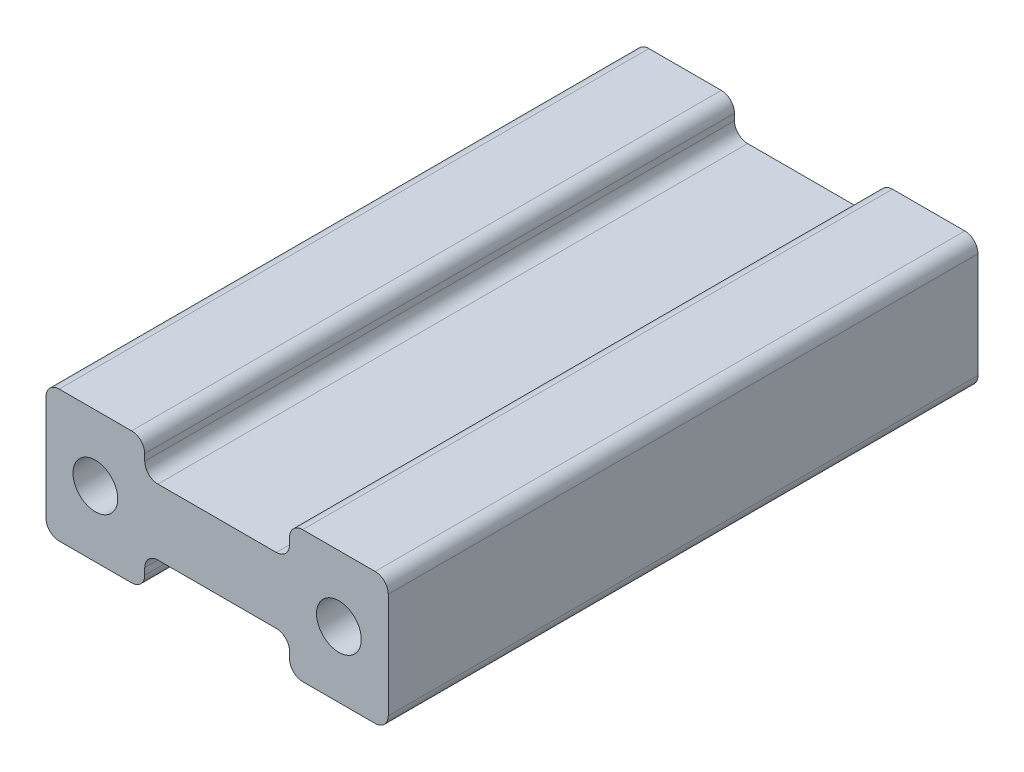
ISO-10303-21;
HEADER;
FILE_DESCRIPTION(('STEP AP214'),'2;1');
FILE_NAME('part.step','',(''),(''),'','','');
FILE_SCHEMA(('AUTOMOTIVE_DESIGN { 1 0 10303 214 1 1 1 1 }'));
ENDSEC;
DATA;
#1=APPLICATION_CONTEXT('core data for automotive mechanical design processes');
#2=APPLICATION_PROTOCOL_DEFINITION('international standard','automotive_design',2000,#1);
#3=PRODUCT_CONTEXT('',#1,'mechanical');
#4=PRODUCT('Part','Part','',(#3));
#5=PRODUCT_RELATED_PRODUCT_CATEGORY('part','',(#4));
#6=PRODUCT_DEFINITION_FORMATION('','',#4);
#7=PRODUCT_DEFINITION_CONTEXT('part definition',#1,'design');
#8=PRODUCT_DEFINITION('design','',#6,#7);
#9=PRODUCT_DEFINITION_SHAPE('','',#8);
#10=(LENGTH_UNIT() NAMED_UNIT(*) SI_UNIT(.MILLI.,.METRE.));
#11=(NAMED_UNIT(*) PLANE_ANGLE_UNIT() SI_UNIT($,.RADIAN.));
#12=(NAMED_UNIT(*) SI_UNIT($,.STERADIAN.) SOLID_ANGLE_UNIT());
#13=UNCERTAINTY_MEASURE_WITH_UNIT(LENGTH_MEASURE(1.E-05),#10,'distance_accuracy_value','');
#14=(GEOMETRIC_REPRESENTATION_CONTEXT(3) GLOBAL_UNCERTAINTY_ASSIGNED_CONTEXT((#13)) GLOBAL_UNIT_ASSIGNED_CONTEXT((#10,
#11,#12)) REPRESENTATION_CONTEXT('',''));
#15=CARTESIAN_POINT('',(0.,0.,0.));
#16=DIRECTION('',(0.,0.,1.));
#17=DIRECTION('',(1.,0.,0.));
#18=AXIS2_PLACEMENT_3D('',#15,#16,#17);
#19=CARTESIAN_POINT('',(-5.5,-5.,22.4));
#20=DIRECTION('',(-1.,0.,0.));
#21=DIRECTION('',(0.,0.,1.));
#22=AXIS2_PLACEMENT_3D('',#19,#20,#21);
#23=PLANE('',#22);
#24=DIRECTION('',(0.,1.,0.));
#25=VECTOR('',#24,1.);
#26=CARTESIAN_POINT('',(-5.5,-5.,22.4));
#27=LINE('',#26,#25);
#28=CARTESIAN_POINT('',(-5.5,-4.,22.4));
#29=VERTEX_POINT('',#28);
#30=CARTESIAN_POINT('',(-5.5,-3.5,22.4));
#31=VERTEX_POINT('',#30);
#32=EDGE_CURVE('E272',#29,#31,#27,.T.);
#33=ORIENTED_EDGE('',*,*,#32,.F.);
#34=DIRECTION('',(0.,0.,-1.));
#35=VECTOR('',#34,1.);
#36=CARTESIAN_POINT('',(-5.5,-4.,22.4));
#37=LINE('',#36,#35);
#38=CARTESIAN_POINT('',(-5.5,-4.,-22.4));
#39=VERTEX_POINT('',#38);
#40=EDGE_CURVE('E359',#29,#39,#37,.T.);
#41=ORIENTED_EDGE('',*,*,#40,.T.);
#42=DIRECTION('',(0.,1.,0.));
#43=VECTOR('',#42,1.);
#44=CARTESIAN_POINT('',(-5.5,-5.,-22.4));
#45=LINE('',#44,#43);
#46=CARTESIAN_POINT('',(-5.5,-3.5,-22.4));
#47=VERTEX_POINT('',#46);
#48=EDGE_CURVE('E450',#39,#47,#45,.T.);
#49=ORIENTED_EDGE('',*,*,#48,.T.);
#50=DIRECTION('',(0.,0.,-1.));
#51=VECTOR('',#50,1.);
#52=CARTESIAN_POINT('',(-5.5,-3.5,22.4));
#53=LINE('',#52,#51);
#54=EDGE_CURVE('E356',#47,#31,#53,.F.);
#55=ORIENTED_EDGE('',*,*,#54,.T.);
#56=EDGE_LOOP('',(#33,#41,#49,#55));
#57=FACE_BOUND('',#56,.T.);
#58=ADVANCED_FACE('F45',(#57),#23,.F.);
#59=CARTESIAN_POINT('',(-5.5,-2.5,22.4));
#60=DIRECTION('',(0.,1.,0.));
#61=DIRECTION('',(0.,0.,1.));
#62=AXIS2_PLACEMENT_3D('',#59,#60,#61);
#63=PLANE('',#62);
#64=DIRECTION('',(1.,0.,0.));
#65=VECTOR('',#64,1.);
#66=CARTESIAN_POINT('',(-5.5,-2.5,-22.4));
#67=LINE('',#66,#65);
#68=CARTESIAN_POINT('',(-4.5,-2.5,-22.4));
#69=VERTEX_POINT('',#68);
#70=CARTESIAN_POINT('',(4.5,-2.5,-22.4));
#71=VERTEX_POINT('',#70);
#72=EDGE_CURVE('E454',#69,#71,#67,.T.);
#73=ORIENTED_EDGE('',*,*,#72,.T.);
#74=DIRECTION('',(0.,0.,-1.));
#75=VECTOR('',#74,1.);
#76=CARTESIAN_POINT('',(4.5,-2.5,22.4));
#77=LINE('',#76,#75);
#78=CARTESIAN_POINT('',(4.5,-2.5,22.4));
#79=VERTEX_POINT('',#78);
#80=EDGE_CURVE('E353',#71,#79,#77,.F.);
#81=ORIENTED_EDGE('',*,*,#80,.T.);
#82=DIRECTION('',(1.,0.,0.));
#83=VECTOR('',#82,1.);
#84=CARTESIAN_POINT('',(-5.5,-2.5,22.4));
#85=LINE('',#84,#83);
#86=CARTESIAN_POINT('',(-4.5,-2.5,22.4));
#87=VERTEX_POINT('',#86);
#88=EDGE_CURVE('E481',#87,#79,#85,.T.);
#89=ORIENTED_EDGE('',*,*,#88,.F.);
#90=DIRECTION('',(0.,0.,-1.));
#91=VECTOR('',#90,1.);
#92=CARTESIAN_POINT('',(-4.5,-2.5,-22.4));
#93=LINE('',#92,#91);
#94=EDGE_CURVE('E349',#87,#69,#93,.T.);
#95=ORIENTED_EDGE('',*,*,#94,.T.);
#96=EDGE_LOOP('',(#73,#81,#89,#95));
#97=FACE_BOUND('',#96,.T.);
#98=ADVANCED_FACE('F508',(#97),#63,.F.);
#99=CARTESIAN_POINT('',(5.5,-5.,22.4));
#100=DIRECTION('',(1.,0.,0.));
#101=DIRECTION('',(0.,0.,-1.));
#102=AXIS2_PLACEMENT_3D('',#99,#100,#101);
#103=PLANE('',#102);
#104=DIRECTION('',(0.,-1.,0.));
#105=VECTOR('',#104,1.);
#106=CARTESIAN_POINT('',(5.5,-5.,22.4));
#107=LINE('',#106,#105);
#108=CARTESIAN_POINT('',(5.5,-3.5,22.4));
#109=VERTEX_POINT('',#108);
#110=CARTESIAN_POINT('',(5.5,-4.,22.4));
#111=VERTEX_POINT('',#110);
#112=EDGE_CURVE('E473',#109,#111,#107,.T.);
#113=ORIENTED_EDGE('',*,*,#112,.F.);
#114=DIRECTION('',(0.,0.,-1.));
#115=VECTOR('',#114,1.);
#116=CARTESIAN_POINT('',(5.5,-3.5,-22.4));
#117=LINE('',#116,#115);
#118=CARTESIAN_POINT('',(5.5,-3.5,-22.4));
#119=VERTEX_POINT('',#118);
#120=EDGE_CURVE('E345',#109,#119,#117,.T.);
#121=ORIENTED_EDGE('',*,*,#120,.T.);
#122=DIRECTION('',(0.,-1.,0.));
#123=VECTOR('',#122,1.);
#124=CARTESIAN_POINT('',(5.5,-5.,-22.4));
#125=LINE('',#124,#123);
#126=CARTESIAN_POINT('',(5.5,-4.,-22.4));
#127=VERTEX_POINT('',#126);
#128=EDGE_CURVE('E246',#119,#127,#125,.T.);
#129=ORIENTED_EDGE('',*,*,#128,.T.);
#130=DIRECTION('',(0.,0.,-1.));
#131=VECTOR('',#130,1.);
#132=CARTESIAN_POINT('',(5.5,-4.,22.4));
#133=LINE('',#132,#131);
#134=EDGE_CURVE('E342',#127,#111,#133,.F.);
#135=ORIENTED_EDGE('',*,*,#134,.T.);
#136=EDGE_LOOP('',(#113,#121,#129,#135));
#137=FACE_BOUND('',#136,.T.);
#138=ADVANCED_FACE('F464',(#137),#103,.F.);
#139=CARTESIAN_POINT('',(13.,-5.,22.4));
#140=DIRECTION('',(0.,1.,0.));
#141=DIRECTION('',(0.,0.,1.));
#142=AXIS2_PLACEMENT_3D('',#139,#140,#141);
#143=PLANE('',#142);
#144=DIRECTION('',(1.,0.,0.));
#145=VECTOR('',#144,1.);
#146=CARTESIAN_POINT('',(13.,-5.,-22.4));
#147=LINE('',#146,#145);
#148=CARTESIAN_POINT('',(6.5,-5.,-22.4));
#149=VERTEX_POINT('',#148);
#150=CARTESIAN_POINT('',(12.,-5.,-22.4));
#151=VERTEX_POINT('',#150);
#152=EDGE_CURVE('E239',#149,#151,#147,.T.);
#153=ORIENTED_EDGE('',*,*,#152,.T.);
#154=DIRECTION('',(0.,0.,-1.));
#155=VECTOR('',#154,1.);
#156=CARTESIAN_POINT('',(12.,-5.,22.4));
#157=LINE('',#156,#155);
#158=CARTESIAN_POINT('',(12.,-5.,22.4));
#159=VERTEX_POINT('',#158);
#160=EDGE_CURVE('E213',#151,#159,#157,.F.);
#161=ORIENTED_EDGE('',*,*,#160,.T.);
#162=DIRECTION('',(1.,0.,0.));
#163=VECTOR('',#162,1.);
#164=CARTESIAN_POINT('',(13.,-5.,22.4));
#165=LINE('',#164,#163);
#166=CARTESIAN_POINT('',(6.5,-5.,22.4));
#167=VERTEX_POINT('',#166);
#168=EDGE_CURVE('E472',#167,#159,#165,.T.);
#169=ORIENTED_EDGE('',*,*,#168,.F.);
#170=DIRECTION('',(0.,0.,-1.));
#171=VECTOR('',#170,1.);
#172=CARTESIAN_POINT('',(6.5,-5.,22.4));
#173=LINE('',#172,#171);
#174=EDGE_CURVE('E219',#167,#149,#173,.T.);
#175=ORIENTED_EDGE('',*,*,#174,.T.);
#176=EDGE_LOOP('',(#153,#161,#169,#175));
#177=FACE_BOUND('',#176,.T.);
#178=ADVANCED_FACE('F475',(#177),#143,.F.);
#179=CARTESIAN_POINT('',(13.,-5.,22.4));
#180=DIRECTION('',(-1.,0.,0.));
#181=DIRECTION('',(0.,-1.,0.));
#182=AXIS2_PLACEMENT_3D('',#179,#180,#181);
#183=PLANE('',#182);
#184=DIRECTION('',(0.,1.,0.));
#185=VECTOR('',#184,1.);
#186=CARTESIAN_POINT('',(13.,-5.,22.4));
#187=LINE('',#186,#185);
#188=CARTESIAN_POINT('',(13.,-4.,22.4));
#189=VERTEX_POINT('',#188);
#190=CARTESIAN_POINT('',(13.,4.,22.4));
#191=VERTEX_POINT('',#190);
#192=EDGE_CURVE('E229',#189,#191,#187,.T.);
#193=ORIENTED_EDGE('',*,*,#192,.F.);
#194=DIRECTION('',(0.,0.,-1.));
#195=VECTOR('',#194,1.);
#196=CARTESIAN_POINT('',(13.,-4.,22.4));
#197=LINE('',#196,#195);
#198=CARTESIAN_POINT('',(13.,-4.,-22.4));
#199=VERTEX_POINT('',#198);
#200=EDGE_CURVE('E212',#189,#199,#197,.T.);
#201=ORIENTED_EDGE('',*,*,#200,.T.);
#202=DIRECTION('',(0.,1.,0.));
#203=VECTOR('',#202,1.);
#204=CARTESIAN_POINT('',(13.,-5.,-22.4));
#205=LINE('',#204,#203);
#206=CARTESIAN_POINT('',(13.,4.,-22.4));
#207=VERTEX_POINT('',#206);
#208=EDGE_CURVE('E226',#199,#207,#205,.T.);
#209=ORIENTED_EDGE('',*,*,#208,.T.);
#210=DIRECTION('',(0.,0.,-1.));
#211=VECTOR('',#210,1.);
#212=CARTESIAN_POINT('',(13.,4.,22.4));
#213=LINE('',#212,#211);
#214=EDGE_CURVE('E232',#207,#191,#213,.F.);
#215=ORIENTED_EDGE('',*,*,#214,.T.);
#216=EDGE_LOOP('',(#193,#201,#209,#215));
#217=FACE_BOUND('',#216,.T.);
#218=ADVANCED_FACE('F225',(#217),#183,.F.);
#219=CARTESIAN_POINT('',(13.,5.,22.4));
#220=DIRECTION('',(0.,-1.,0.));
#221=DIRECTION('',(0.,0.,-1.));
#222=AXIS2_PLACEMENT_3D('',#219,#220,#221);
#223=PLANE('',#222);
#224=DIRECTION('',(-1.,0.,0.));
#225=VECTOR('',#224,1.);
#226=CARTESIAN_POINT('',(13.,5.,22.4));
#227=LINE('',#226,#225);
#228=CARTESIAN_POINT('',(12.,5.,22.4));
#229=VERTEX_POINT('',#228);
#230=CARTESIAN_POINT('',(6.5,5.,22.4));
#231=VERTEX_POINT('',#230);
#232=EDGE_CURVE('E438',#229,#231,#227,.T.);
#233=ORIENTED_EDGE('',*,*,#232,.F.);
#234=DIRECTION('',(0.,0.,-1.));
#235=VECTOR('',#234,1.);
#236=CARTESIAN_POINT('',(12.,5.,22.4));
#237=LINE('',#236,#235);
#238=CARTESIAN_POINT('',(12.,5.,-22.4));
#239=VERTEX_POINT('',#238);
#240=EDGE_CURVE('E380',#229,#239,#237,.T.);
#241=ORIENTED_EDGE('',*,*,#240,.T.);
#242=DIRECTION('',(-1.,0.,0.));
#243=VECTOR('',#242,1.);
#244=CARTESIAN_POINT('',(13.,5.,-22.4));
#245=LINE('',#244,#243);
#246=CARTESIAN_POINT('',(6.5,5.,-22.4));
#247=VERTEX_POINT('',#246);
#248=EDGE_CURVE('E238',#239,#247,#245,.T.);
#249=ORIENTED_EDGE('',*,*,#248,.T.);
#250=DIRECTION('',(0.,0.,-1.));
#251=VECTOR('',#250,1.);
#252=CARTESIAN_POINT('',(6.5,5.,22.4));
#253=LINE('',#252,#251);
#254=EDGE_CURVE('E377',#247,#231,#253,.F.);
#255=ORIENTED_EDGE('',*,*,#254,.T.);
#256=EDGE_LOOP('',(#233,#241,#249,#255));
#257=FACE_BOUND('',#256,.T.);
#258=ADVANCED_FACE('F494',(#257),#223,.F.);
#259=CARTESIAN_POINT('',(5.5,5.,22.4));
#260=DIRECTION('',(1.,0.,0.));
#261=DIRECTION('',(0.,0.,-1.));
#262=AXIS2_PLACEMENT_3D('',#259,#260,#261);
#263=PLANE('',#262);
#264=DIRECTION('',(0.,-1.,0.));
#265=VECTOR('',#264,1.);
#266=CARTESIAN_POINT('',(5.5,5.,22.4));
#267=LINE('',#266,#265);
#268=CARTESIAN_POINT('',(5.5,4.,22.4));
#269=VERTEX_POINT('',#268);
#270=CARTESIAN_POINT('',(5.5,3.5,22.4));
#271=VERTEX_POINT('',#270);
#272=EDGE_CURVE('E426',#269,#271,#267,.T.);
#273=ORIENTED_EDGE('',*,*,#272,.F.);
#274=DIRECTION('',(0.,0.,-1.));
#275=VECTOR('',#274,1.);
#276=CARTESIAN_POINT('',(5.5,4.,22.4));
#277=LINE('',#276,#275);
#278=CARTESIAN_POINT('',(5.5,4.,-22.4));
#279=VERTEX_POINT('',#278);
#280=EDGE_CURVE('E387',#269,#279,#277,.T.);
#281=ORIENTED_EDGE('',*,*,#280,.T.);
#282=DIRECTION('',(0.,-1.,0.));
#283=VECTOR('',#282,1.);
#284=CARTESIAN_POINT('',(5.5,5.,-22.4));
#285=LINE('',#284,#283);
#286=CARTESIAN_POINT('',(5.5,3.5,-22.4));
#287=VERTEX_POINT('',#286);
#288=EDGE_CURVE('E244',#279,#287,#285,.T.);
#289=ORIENTED_EDGE('',*,*,#288,.T.);
#290=DIRECTION('',(0.,0.,-1.));
#291=VECTOR('',#290,1.);
#292=CARTESIAN_POINT('',(5.5,3.5,22.4));
#293=LINE('',#292,#291);
#294=EDGE_CURVE('E384',#287,#271,#293,.F.);
#295=ORIENTED_EDGE('',*,*,#294,.T.);
#296=EDGE_LOOP('',(#273,#281,#289,#295));
#297=FACE_BOUND('',#296,.T.);
#298=ADVANCED_FACE('F416',(#297),#263,.F.);
#299=CARTESIAN_POINT('',(-5.5,2.5,22.4));
#300=DIRECTION('',(0.,-1.,0.));
#301=DIRECTION('',(0.,0.,-1.));
#302=AXIS2_PLACEMENT_3D('',#299,#300,#301);
#303=PLANE('',#302);
#304=DIRECTION('',(-1.,0.,0.));
#305=VECTOR('',#304,1.);
#306=CARTESIAN_POINT('',(-5.5,2.5,-22.4));
#307=LINE('',#306,#305);
#308=CARTESIAN_POINT('',(4.5,2.5,-22.4));
#309=VERTEX_POINT('',#308);
#310=CARTESIAN_POINT('',(-4.5,2.5,-22.4));
#311=VERTEX_POINT('',#310);
#312=EDGE_CURVE('E253',#309,#311,#307,.T.);
#313=ORIENTED_EDGE('',*,*,#312,.T.);
#314=DIRECTION('',(0.,0.,-1.));
#315=VECTOR('',#314,1.);
#316=CARTESIAN_POINT('',(-4.5,2.5,22.4));
#317=LINE('',#316,#315);
#318=CARTESIAN_POINT('',(-4.5,2.5,22.4));
#319=VERTEX_POINT('',#318);
#320=EDGE_CURVE('E374',#311,#319,#317,.F.);
#321=ORIENTED_EDGE('',*,*,#320,.T.);
#322=DIRECTION('',(-1.,0.,0.));
#323=VECTOR('',#322,1.);
#324=CARTESIAN_POINT('',(-5.5,2.5,22.4));
#325=LINE('',#324,#323);
#326=CARTESIAN_POINT('',(4.5,2.5,22.4));
#327=VERTEX_POINT('',#326);
#328=EDGE_CURVE('E424',#327,#319,#325,.T.);
#329=ORIENTED_EDGE('',*,*,#328,.F.);
#330=DIRECTION('',(0.,0.,-1.));
#331=VECTOR('',#330,1.);
#332=CARTESIAN_POINT('',(4.5,2.5,-22.4));
#333=LINE('',#332,#331);
#334=EDGE_CURVE('E370',#327,#309,#333,.T.);
#335=ORIENTED_EDGE('',*,*,#334,.T.);
#336=EDGE_LOOP('',(#313,#321,#329,#335));
#337=FACE_BOUND('',#336,.T.);
#338=ADVANCED_FACE('F428',(#337),#303,.F.);
#339=CARTESIAN_POINT('',(-5.5,5.,22.4));
#340=DIRECTION('',(-1.,0.,0.));
#341=DIRECTION('',(0.,0.,1.));
#342=AXIS2_PLACEMENT_3D('',#339,#340,#341);
#343=PLANE('',#342);
#344=DIRECTION('',(0.,1.,0.));
#345=VECTOR('',#344,1.);
#346=CARTESIAN_POINT('',(-5.5,5.,22.4));
#347=LINE('',#346,#345);
#348=CARTESIAN_POINT('',(-5.5,3.5,22.4));
#349=VERTEX_POINT('',#348);
#350=CARTESIAN_POINT('',(-5.5,4.,22.4));
#351=VERTEX_POINT('',#350);
#352=EDGE_CURVE('E431',#349,#351,#347,.T.);
#353=ORIENTED_EDGE('',*,*,#352,.F.);
#354=DIRECTION('',(0.,0.,-1.));
#355=VECTOR('',#354,1.);
#356=CARTESIAN_POINT('',(-5.5,3.5,-22.4));
#357=LINE('',#356,#355);
#358=CARTESIAN_POINT('',(-5.5,3.5,-22.4));
#359=VERTEX_POINT('',#358);
#360=EDGE_CURVE('E366',#349,#359,#357,.T.);
#361=ORIENTED_EDGE('',*,*,#360,.T.);
#362=DIRECTION('',(0.,1.,0.));
#363=VECTOR('',#362,1.);
#364=CARTESIAN_POINT('',(-5.5,5.,-22.4));
#365=LINE('',#364,#363);
#366=CARTESIAN_POINT('',(-5.5,4.,-22.4));
#367=VERTEX_POINT('',#366);
#368=EDGE_CURVE('E257',#359,#367,#365,.T.);
#369=ORIENTED_EDGE('',*,*,#368,.T.);
#370=DIRECTION('',(0.,0.,-1.));
#371=VECTOR('',#370,1.);
#372=CARTESIAN_POINT('',(-5.5,4.,22.4));
#373=LINE('',#372,#371);
#374=EDGE_CURVE('E363',#367,#351,#373,.F.);
#375=ORIENTED_EDGE('',*,*,#374,.T.);
#376=EDGE_LOOP('',(#353,#361,#369,#375));
#377=FACE_BOUND('',#376,.T.);
#378=ADVANCED_FACE('F551',(#377),#343,.F.);
#379=CARTESIAN_POINT('',(-13.,5.,22.4));
#380=DIRECTION('',(0.,-1.,0.));
#381=DIRECTION('',(0.,0.,-1.));
#382=AXIS2_PLACEMENT_3D('',#379,#380,#381);
#383=PLANE('',#382);
#384=DIRECTION('',(-1.,0.,0.));
#385=VECTOR('',#384,1.);
#386=CARTESIAN_POINT('',(-13.,5.,-22.4));
#387=LINE('',#386,#385);
#388=CARTESIAN_POINT('',(-6.5,5.,-22.4));
#389=VERTEX_POINT('',#388);
#390=CARTESIAN_POINT('',(-12.,5.,-22.4));
#391=VERTEX_POINT('',#390);
#392=EDGE_CURVE('E261',#389,#391,#387,.T.);
#393=ORIENTED_EDGE('',*,*,#392,.T.);
#394=DIRECTION('',(0.,0.,-1.));
#395=VECTOR('',#394,1.);
#396=CARTESIAN_POINT('',(-12.,5.,22.4));
#397=LINE('',#396,#395);
#398=CARTESIAN_POINT('',(-12.,5.,22.4));
#399=VERTEX_POINT('',#398);
#400=EDGE_CURVE('E339',#391,#399,#397,.F.);
#401=ORIENTED_EDGE('',*,*,#400,.T.);
#402=DIRECTION('',(-1.,0.,0.));
#403=VECTOR('',#402,1.);
#404=CARTESIAN_POINT('',(-13.,5.,22.4));
#405=LINE('',#404,#403);
#406=CARTESIAN_POINT('',(-6.5,5.,22.4));
#407=VERTEX_POINT('',#406);
#408=EDGE_CURVE('E436',#407,#399,#405,.T.);
#409=ORIENTED_EDGE('',*,*,#408,.F.);
#410=DIRECTION('',(0.,0.,-1.));
#411=VECTOR('',#410,1.);
#412=CARTESIAN_POINT('',(-6.5,5.,22.4));
#413=LINE('',#412,#411);
#414=EDGE_CURVE('E335',#407,#389,#413,.T.);
#415=ORIENTED_EDGE('',*,*,#414,.T.);
#416=EDGE_LOOP('',(#393,#401,#409,#415));
#417=FACE_BOUND('',#416,.T.);
#418=ADVANCED_FACE('F558',(#417),#383,.F.);
#419=CARTESIAN_POINT('',(-13.,-5.,22.4));
#420=DIRECTION('',(1.,0.,0.));
#421=DIRECTION('',(0.,1.,0.));
#422=AXIS2_PLACEMENT_3D('',#419,#420,#421);
#423=PLANE('',#422);
#424=DIRECTION('',(0.,-1.,0.));
#425=VECTOR('',#424,1.);
#426=CARTESIAN_POINT('',(-13.,-5.,-22.4));
#427=LINE('',#426,#425);
#428=CARTESIAN_POINT('',(-13.,4.,-22.4));
#429=VERTEX_POINT('',#428);
#430=CARTESIAN_POINT('',(-13.,-4.,-22.4));
#431=VERTEX_POINT('',#430);
#432=EDGE_CURVE('E265',#429,#431,#427,.T.);
#433=ORIENTED_EDGE('',*,*,#432,.T.);
#434=DIRECTION('',(0.,0.,-1.));
#435=VECTOR('',#434,1.);
#436=CARTESIAN_POINT('',(-13.,-4.,22.4));
#437=LINE('',#436,#435);
#438=CARTESIAN_POINT('',(-13.,-4.,22.4));
#439=VERTEX_POINT('',#438);
#440=EDGE_CURVE('E332',#431,#439,#437,.F.);
#441=ORIENTED_EDGE('',*,*,#440,.T.);
#442=DIRECTION('',(0.,-1.,0.));
#443=VECTOR('',#442,1.);
#444=CARTESIAN_POINT('',(-13.,-5.,22.4));
#445=LINE('',#444,#443);
#446=CARTESIAN_POINT('',(-13.,4.,22.4));
#447=VERTEX_POINT('',#446);
#448=EDGE_CURVE('E445',#447,#439,#445,.T.);
#449=ORIENTED_EDGE('',*,*,#448,.F.);
#450=DIRECTION('',(0.,0.,-1.));
#451=VECTOR('',#450,1.);
#452=CARTESIAN_POINT('',(-13.,4.,22.4));
#453=LINE('',#452,#451);
#454=EDGE_CURVE('E328',#447,#429,#453,.T.);
#455=ORIENTED_EDGE('',*,*,#454,.T.);
#456=EDGE_LOOP('',(#433,#441,#449,#455));
#457=FACE_BOUND('',#456,.T.);
#458=ADVANCED_FACE('F564',(#457),#423,.F.);
#459=CARTESIAN_POINT('',(-13.,-5.,22.4));
#460=DIRECTION('',(0.,1.,0.));
#461=DIRECTION('',(0.,0.,1.));
#462=AXIS2_PLACEMENT_3D('',#459,#460,#461);
#463=PLANE('',#462);
#464=DIRECTION('',(1.,0.,0.));
#465=VECTOR('',#464,1.);
#466=CARTESIAN_POINT('',(-13.,-5.,22.4));
#467=LINE('',#466,#465);
#468=CARTESIAN_POINT('',(-12.,-5.,22.4));
#469=VERTEX_POINT('',#468);
#470=CARTESIAN_POINT('',(-6.5,-5.,22.4));
#471=VERTEX_POINT('',#470);
#472=EDGE_CURVE('E274',#469,#471,#467,.T.);
#473=ORIENTED_EDGE('',*,*,#472,.F.);
#474=DIRECTION('',(0.,0.,-1.));
#475=VECTOR('',#474,1.);
#476=CARTESIAN_POINT('',(-12.,-5.,22.4));
#477=LINE('',#476,#475);
#478=CARTESIAN_POINT('',(-12.,-5.,-22.4));
#479=VERTEX_POINT('',#478);
#480=EDGE_CURVE('E324',#469,#479,#477,.T.);
#481=ORIENTED_EDGE('',*,*,#480,.T.);
#482=DIRECTION('',(1.,0.,0.));
#483=VECTOR('',#482,1.);
#484=CARTESIAN_POINT('',(-13.,-5.,-22.4));
#485=LINE('',#484,#483);
#486=CARTESIAN_POINT('',(-6.5,-5.,-22.4));
#487=VERTEX_POINT('',#486);
#488=EDGE_CURVE('E269',#479,#487,#485,.T.);
#489=ORIENTED_EDGE('',*,*,#488,.T.);
#490=DIRECTION('',(0.,0.,-1.));
#491=VECTOR('',#490,1.);
#492=CARTESIAN_POINT('',(-6.5,-5.,22.4));
#493=LINE('',#492,#491);
#494=EDGE_CURVE('E61',#487,#471,#493,.F.);
#495=ORIENTED_EDGE('',*,*,#494,.T.);
#496=EDGE_LOOP('',(#473,#481,#489,#495));
#497=FACE_BOUND('',#496,.T.);
#498=ADVANCED_FACE('F569',(#497),#463,.F.);
#499=CARTESIAN_POINT('',(0.,0.,22.4));
#500=DIRECTION('',(0.,0.,-1.));
#501=DIRECTION('',(-1.,0.,0.));
#502=AXIS2_PLACEMENT_3D('',#499,#500,#501);
#503=PLANE('',#502);
#504=CARTESIAN_POINT('',(-9.25,0.,22.4));
#505=DIRECTION('',(0.,0.,-1.));
#506=DIRECTION('',(-1.,0.,0.));
#507=AXIS2_PLACEMENT_3D('',#504,#505,#506);
#508=CIRCLE('',#507,1.69999999999999);
#509=CARTESIAN_POINT('',(-10.95,0.,22.4));
#510=VERTEX_POINT('',#509);
#511=EDGE_CURVE('E588',#510,#510,#508,.T.);
#512=ORIENTED_EDGE('',*,*,#511,.T.);
#513=EDGE_LOOP('',(#512));
#514=FACE_BOUND('',#513,.T.);
#515=CARTESIAN_POINT('',(9.25,0.,22.4));
#516=DIRECTION('',(0.,0.,-1.));
#517=DIRECTION('',(-1.,0.,0.));
#518=AXIS2_PLACEMENT_3D('',#515,#516,#517);
#519=CIRCLE('',#518,1.69999999999999);
#520=CARTESIAN_POINT('',(7.55000000000001,0.,22.4));
#521=VERTEX_POINT('',#520);
#522=EDGE_CURVE('E455',#521,#521,#519,.T.);
#523=ORIENTED_EDGE('',*,*,#522,.T.);
#524=EDGE_LOOP('',(#523));
#525=FACE_BOUND('',#524,.T.);
#526=ORIENTED_EDGE('',*,*,#168,.T.);
#527=CARTESIAN_POINT('',(12.,-4.,22.4));
#528=DIRECTION('',(0.,0.,-1.));
#529=DIRECTION('',(-1.,0.,0.));
#530=AXIS2_PLACEMENT_3D('',#527,#528,#529);
#531=CIRCLE('',#530,1.);
#532=EDGE_CURVE('E319',#159,#189,#531,.F.);
#533=ORIENTED_EDGE('',*,*,#532,.T.);
#534=ORIENTED_EDGE('',*,*,#192,.T.);
#535=CARTESIAN_POINT('',(12.,4.,22.4));
#536=DIRECTION('',(0.,0.,-1.));
#537=DIRECTION('',(-1.,0.,0.));
#538=AXIS2_PLACEMENT_3D('',#535,#536,#537);
#539=CIRCLE('',#538,1.);
#540=EDGE_CURVE('E302',#191,#229,#539,.F.);
#541=ORIENTED_EDGE('',*,*,#540,.T.);
#542=ORIENTED_EDGE('',*,*,#232,.T.);
#543=CARTESIAN_POINT('',(6.5,4.,22.4));
#544=DIRECTION('',(0.,0.,-1.));
#545=DIRECTION('',(-1.,0.,0.));
#546=AXIS2_PLACEMENT_3D('',#543,#544,#545);
#547=CIRCLE('',#546,1.);
#548=EDGE_CURVE('E299',#231,#269,#547,.F.);
#549=ORIENTED_EDGE('',*,*,#548,.T.);
#550=ORIENTED_EDGE('',*,*,#272,.T.);
#551=CARTESIAN_POINT('',(4.5,3.5,22.4));
#552=DIRECTION('',(0.,0.,-1.));
#553=DIRECTION('',(-1.,0.,0.));
#554=AXIS2_PLACEMENT_3D('',#551,#552,#553);
#555=CIRCLE('',#554,1.);
#556=EDGE_CURVE('E11',#271,#327,#555,.T.);
#557=ORIENTED_EDGE('',*,*,#556,.T.);
#558=ORIENTED_EDGE('',*,*,#328,.T.);
#559=CARTESIAN_POINT('',(-4.5,3.5,22.4));
#560=DIRECTION('',(0.,0.,-1.));
#561=DIRECTION('',(-1.,0.,0.));
#562=AXIS2_PLACEMENT_3D('',#559,#560,#561);
#563=CIRCLE('',#562,1.);
#564=EDGE_CURVE('E406',#319,#349,#563,.T.);
#565=ORIENTED_EDGE('',*,*,#564,.T.);
#566=ORIENTED_EDGE('',*,*,#352,.T.);
#567=CARTESIAN_POINT('',(-6.5,4.,22.4));
#568=DIRECTION('',(0.,0.,-1.));
#569=DIRECTION('',(-1.,0.,0.));
#570=AXIS2_PLACEMENT_3D('',#567,#568,#569);
#571=CIRCLE('',#570,1.);
#572=EDGE_CURVE('E305',#351,#407,#571,.F.);
#573=ORIENTED_EDGE('',*,*,#572,.T.);
#574=ORIENTED_EDGE('',*,*,#408,.T.);
#575=CARTESIAN_POINT('',(-12.,4.,22.4));
#576=DIRECTION('',(0.,0.,-1.));
#577=DIRECTION('',(-1.,0.,0.));
#578=AXIS2_PLACEMENT_3D('',#575,#576,#577);
#579=CIRCLE('',#578,1.);
#580=EDGE_CURVE('E314',#399,#447,#579,.F.);
#581=ORIENTED_EDGE('',*,*,#580,.T.);
#582=ORIENTED_EDGE('',*,*,#448,.T.);
#583=CARTESIAN_POINT('',(-12.,-4.,22.4));
#584=DIRECTION('',(0.,0.,-1.));
#585=DIRECTION('',(-1.,0.,0.));
#586=AXIS2_PLACEMENT_3D('',#583,#584,#585);
#587=CIRCLE('',#586,1.);
#588=EDGE_CURVE('E68',#439,#469,#587,.F.);
#589=ORIENTED_EDGE('',*,*,#588,.T.);
#590=ORIENTED_EDGE('',*,*,#472,.T.);
#591=CARTESIAN_POINT('',(-6.5,-4.,22.4));
#592=DIRECTION('',(0.,0.,-1.));
#593=DIRECTION('',(-1.,0.,0.));
#594=AXIS2_PLACEMENT_3D('',#591,#592,#593);
#595=CIRCLE('',#594,1.);
#596=EDGE_CURVE('E308',#471,#29,#595,.F.);
#597=ORIENTED_EDGE('',*,*,#596,.T.);
#598=ORIENTED_EDGE('',*,*,#32,.T.);
#599=CARTESIAN_POINT('',(-4.5,-3.5,22.4));
#600=DIRECTION('',(0.,0.,-1.));
#601=DIRECTION('',(-1.,0.,0.));
#602=AXIS2_PLACEMENT_3D('',#599,#600,#601);
#603=CIRCLE('',#602,1.);
#604=EDGE_CURVE('E400',#31,#87,#603,.T.);
#605=ORIENTED_EDGE('',*,*,#604,.T.);
#606=ORIENTED_EDGE('',*,*,#88,.T.);
#607=CARTESIAN_POINT('',(4.5,-3.5,22.4));
#608=DIRECTION('',(0.,0.,-1.));
#609=DIRECTION('',(-1.,0.,0.));
#610=AXIS2_PLACEMENT_3D('',#607,#608,#609);
#611=CIRCLE('',#610,1.);
#612=EDGE_CURVE('E394',#79,#109,#611,.T.);
#613=ORIENTED_EDGE('',*,*,#612,.T.);
#614=ORIENTED_EDGE('',*,*,#112,.T.);
#615=CARTESIAN_POINT('',(6.5,-4.,22.4));
#616=DIRECTION('',(0.,0.,-1.));
#617=DIRECTION('',(-1.,0.,0.));
#618=AXIS2_PLACEMENT_3D('',#615,#616,#617);
#619=CIRCLE('',#618,1.);
#620=EDGE_CURVE('E311',#111,#167,#619,.F.);
#621=ORIENTED_EDGE('',*,*,#620,.T.);
#622=EDGE_LOOP('',(#526,#533,#534,#541,#542,#549,#550,#557,#558,#565,#566,#573,#574,#581,#582,
#589,#590,#597,#598,#605,#606,#613,#614,#621));
#623=FACE_BOUND('',#622,.T.);
#624=ADVANCED_FACE('F423',(#514,#525,#623),#503,.F.);
#625=CARTESIAN_POINT('',(0.,0.,-22.4));
#626=DIRECTION('',(0.,0.,-1.));
#627=DIRECTION('',(-1.,0.,0.));
#628=AXIS2_PLACEMENT_3D('',#625,#626,#627);
#629=PLANE('',#628);
#630=CARTESIAN_POINT('',(-9.25,0.,-22.4));
#631=DIRECTION('',(0.,0.,-1.));
#632=DIRECTION('',(-1.,0.,0.));
#633=AXIS2_PLACEMENT_3D('',#630,#631,#632);
#634=CIRCLE('',#633,1.69999999999999);
#635=CARTESIAN_POINT('',(-10.95,0.,-22.4));
#636=VERTEX_POINT('',#635);
#637=EDGE_CURVE('E592',#636,#636,#634,.T.);
#638=ORIENTED_EDGE('',*,*,#637,.F.);
#639=EDGE_LOOP('',(#638));
#640=FACE_BOUND('',#639,.T.);
#641=CARTESIAN_POINT('',(9.25,0.,-22.4));
#642=DIRECTION('',(0.,0.,-1.));
#643=DIRECTION('',(-1.,0.,0.));
#644=AXIS2_PLACEMENT_3D('',#641,#642,#643);
#645=CIRCLE('',#644,1.69999999999999);
#646=CARTESIAN_POINT('',(7.55000000000001,0.,-22.4));
#647=VERTEX_POINT('',#646);
#648=EDGE_CURVE('E584',#647,#647,#645,.T.);
#649=ORIENTED_EDGE('',*,*,#648,.F.);
#650=EDGE_LOOP('',(#649));
#651=FACE_BOUND('',#650,.T.);
#652=ORIENTED_EDGE('',*,*,#208,.F.);
#653=CARTESIAN_POINT('',(12.,-4.,-22.4));
#654=DIRECTION('',(0.,0.,-1.));
#655=DIRECTION('',(-1.,0.,0.));
#656=AXIS2_PLACEMENT_3D('',#653,#654,#655);
#657=CIRCLE('',#656,1.);
#658=EDGE_CURVE('E208',#199,#151,#657,.T.);
#659=ORIENTED_EDGE('',*,*,#658,.T.);
#660=ORIENTED_EDGE('',*,*,#152,.F.);
#661=CARTESIAN_POINT('',(6.5,-4.,-22.4));
#662=DIRECTION('',(0.,0.,-1.));
#663=DIRECTION('',(-1.,0.,0.));
#664=AXIS2_PLACEMENT_3D('',#661,#662,#663);
#665=CIRCLE('',#664,1.);
#666=EDGE_CURVE('E286',#149,#127,#665,.T.);
#667=ORIENTED_EDGE('',*,*,#666,.T.);
#668=ORIENTED_EDGE('',*,*,#128,.F.);
#669=CARTESIAN_POINT('',(4.5,-3.5,-22.4));
#670=DIRECTION('',(0.,0.,-1.));
#671=DIRECTION('',(-1.,0.,0.));
#672=AXIS2_PLACEMENT_3D('',#669,#670,#671);
#673=CIRCLE('',#672,1.);
#674=EDGE_CURVE('E391',#119,#71,#673,.F.);
#675=ORIENTED_EDGE('',*,*,#674,.T.);
#676=ORIENTED_EDGE('',*,*,#72,.F.);
#677=CARTESIAN_POINT('',(-4.5,-3.5,-22.4));
#678=DIRECTION('',(0.,0.,-1.));
#679=DIRECTION('',(-1.,0.,0.));
#680=AXIS2_PLACEMENT_3D('',#677,#678,#679);
#681=CIRCLE('',#680,1.);
#682=EDGE_CURVE('E397',#69,#47,#681,.F.);
#683=ORIENTED_EDGE('',*,*,#682,.T.);
#684=ORIENTED_EDGE('',*,*,#48,.F.);
#685=CARTESIAN_POINT('',(-6.5,-4.,-22.4));
#686=DIRECTION('',(0.,0.,-1.));
#687=DIRECTION('',(-1.,0.,0.));
#688=AXIS2_PLACEMENT_3D('',#685,#686,#687);
#689=CIRCLE('',#688,1.);
#690=EDGE_CURVE('E283',#39,#487,#689,.T.);
#691=ORIENTED_EDGE('',*,*,#690,.T.);
#692=ORIENTED_EDGE('',*,*,#488,.F.);
#693=CARTESIAN_POINT('',(-12.,-4.,-22.4));
#694=DIRECTION('',(0.,0.,-1.));
#695=DIRECTION('',(-1.,0.,0.));
#696=AXIS2_PLACEMENT_3D('',#693,#694,#695);
#697=CIRCLE('',#696,1.);
#698=EDGE_CURVE('E220',#479,#431,#697,.T.);
#699=ORIENTED_EDGE('',*,*,#698,.T.);
#700=ORIENTED_EDGE('',*,*,#432,.F.);
#701=CARTESIAN_POINT('',(-12.,4.,-22.4));
#702=DIRECTION('',(0.,0.,-1.));
#703=DIRECTION('',(-1.,0.,0.));
#704=AXIS2_PLACEMENT_3D('',#701,#702,#703);
#705=CIRCLE('',#704,1.);
#706=EDGE_CURVE('E289',#429,#391,#705,.T.);
#707=ORIENTED_EDGE('',*,*,#706,.T.);
#708=ORIENTED_EDGE('',*,*,#392,.F.);
#709=CARTESIAN_POINT('',(-6.5,4.,-22.4));
#710=DIRECTION('',(0.,0.,-1.));
#711=DIRECTION('',(-1.,0.,0.));
#712=AXIS2_PLACEMENT_3D('',#709,#710,#711);
#713=CIRCLE('',#712,1.);
#714=EDGE_CURVE('E280',#389,#367,#713,.T.);
#715=ORIENTED_EDGE('',*,*,#714,.T.);
#716=ORIENTED_EDGE('',*,*,#368,.F.);
#717=CARTESIAN_POINT('',(-4.5,3.5,-22.4));
#718=DIRECTION('',(0.,0.,-1.));
#719=DIRECTION('',(-1.,0.,0.));
#720=AXIS2_PLACEMENT_3D('',#717,#718,#719);
#721=CIRCLE('',#720,1.);
#722=EDGE_CURVE('E403',#359,#311,#721,.F.);
#723=ORIENTED_EDGE('',*,*,#722,.T.);
#724=ORIENTED_EDGE('',*,*,#312,.F.);
#725=CARTESIAN_POINT('',(4.5,3.5,-22.4));
#726=DIRECTION('',(0.,0.,-1.));
#727=DIRECTION('',(-1.,0.,0.));
#728=AXIS2_PLACEMENT_3D('',#725,#726,#727);
#729=CIRCLE('',#728,1.);
#730=EDGE_CURVE('E54',#309,#287,#729,.F.);
#731=ORIENTED_EDGE('',*,*,#730,.T.);
#732=ORIENTED_EDGE('',*,*,#288,.F.);
#733=CARTESIAN_POINT('',(6.5,4.,-22.4));
#734=DIRECTION('',(0.,0.,-1.));
#735=DIRECTION('',(-1.,0.,0.));
#736=AXIS2_PLACEMENT_3D('',#733,#734,#735);
#737=CIRCLE('',#736,1.);
#738=EDGE_CURVE('E231',#279,#247,#737,.T.);
#739=ORIENTED_EDGE('',*,*,#738,.T.);
#740=ORIENTED_EDGE('',*,*,#248,.F.);
#741=CARTESIAN_POINT('',(12.,4.,-22.4));
#742=DIRECTION('',(0.,0.,-1.));
#743=DIRECTION('',(-1.,0.,0.));
#744=AXIS2_PLACEMENT_3D('',#741,#742,#743);
#745=CIRCLE('',#744,1.);
#746=EDGE_CURVE('E236',#239,#207,#745,.T.);
#747=ORIENTED_EDGE('',*,*,#746,.T.);
#748=EDGE_LOOP('',(#652,#659,#660,#667,#668,#675,#676,#683,#684,#691,#692,#699,#700,#707,#708,
#715,#716,#723,#724,#731,#732,#739,#740,#747));
#749=FACE_BOUND('',#748,.T.);
#750=ADVANCED_FACE('F234',(#640,#651,#749),#629,.T.);
#751=CARTESIAN_POINT('',(12.,-4.,22.4));
#752=DIRECTION('',(0.,0.,-1.));
#753=DIRECTION('',(-1.,0.,0.));
#754=AXIS2_PLACEMENT_3D('',#751,#752,#753);
#755=CYLINDRICAL_SURFACE('',#754,1.);
#756=ORIENTED_EDGE('',*,*,#532,.F.);
#757=ORIENTED_EDGE('',*,*,#160,.F.);
#758=ORIENTED_EDGE('',*,*,#658,.F.);
#759=ORIENTED_EDGE('',*,*,#200,.F.);
#760=EDGE_LOOP('',(#756,#757,#758,#759));
#761=FACE_BOUND('',#760,.T.);
#762=ADVANCED_FACE('F211',(#761),#755,.T.);
#763=CARTESIAN_POINT('',(-12.,-4.,22.4));
#764=DIRECTION('',(0.,0.,-1.));
#765=DIRECTION('',(-1.,0.,0.));
#766=AXIS2_PLACEMENT_3D('',#763,#764,#765);
#767=CYLINDRICAL_SURFACE('',#766,1.);
#768=ORIENTED_EDGE('',*,*,#588,.F.);
#769=ORIENTED_EDGE('',*,*,#440,.F.);
#770=ORIENTED_EDGE('',*,*,#698,.F.);
#771=ORIENTED_EDGE('',*,*,#480,.F.);
#772=EDGE_LOOP('',(#768,#769,#770,#771));
#773=FACE_BOUND('',#772,.T.);
#774=ADVANCED_FACE('F521',(#773),#767,.T.);
#775=CARTESIAN_POINT('',(-12.,4.,22.4));
#776=DIRECTION('',(0.,0.,-1.));
#777=DIRECTION('',(-1.,0.,0.));
#778=AXIS2_PLACEMENT_3D('',#775,#776,#777);
#779=CYLINDRICAL_SURFACE('',#778,1.);
#780=ORIENTED_EDGE('',*,*,#580,.F.);
#781=ORIENTED_EDGE('',*,*,#400,.F.);
#782=ORIENTED_EDGE('',*,*,#706,.F.);
#783=ORIENTED_EDGE('',*,*,#454,.F.);
#784=EDGE_LOOP('',(#780,#781,#782,#783));
#785=FACE_BOUND('',#784,.T.);
#786=ADVANCED_FACE('F524',(#785),#779,.T.);
#787=CARTESIAN_POINT('',(4.5,-3.5,22.4));
#788=DIRECTION('',(0.,0.,1.));
#789=DIRECTION('',(1.,0.,0.));
#790=AXIS2_PLACEMENT_3D('',#787,#788,#789);
#791=CYLINDRICAL_SURFACE('',#790,1.);
#792=ORIENTED_EDGE('',*,*,#612,.F.);
#793=ORIENTED_EDGE('',*,*,#80,.F.);
#794=ORIENTED_EDGE('',*,*,#674,.F.);
#795=ORIENTED_EDGE('',*,*,#120,.F.);
#796=EDGE_LOOP('',(#792,#793,#794,#795));
#797=FACE_BOUND('',#796,.T.);
#798=ADVANCED_FACE('F528',(#797),#791,.F.);
#799=CARTESIAN_POINT('',(6.5,-4.,22.4));
#800=DIRECTION('',(0.,0.,-1.));
#801=DIRECTION('',(-1.,0.,0.));
#802=AXIS2_PLACEMENT_3D('',#799,#800,#801);
#803=CYLINDRICAL_SURFACE('',#802,1.);
#804=ORIENTED_EDGE('',*,*,#620,.F.);
#805=ORIENTED_EDGE('',*,*,#134,.F.);
#806=ORIENTED_EDGE('',*,*,#666,.F.);
#807=ORIENTED_EDGE('',*,*,#174,.F.);
#808=EDGE_LOOP('',(#804,#805,#806,#807));
#809=FACE_BOUND('',#808,.T.);
#810=ADVANCED_FACE('F469',(#809),#803,.T.);
#811=CARTESIAN_POINT('',(-6.5,-4.,22.4));
#812=DIRECTION('',(0.,0.,-1.));
#813=DIRECTION('',(-1.,0.,0.));
#814=AXIS2_PLACEMENT_3D('',#811,#812,#813);
#815=CYLINDRICAL_SURFACE('',#814,1.);
#816=ORIENTED_EDGE('',*,*,#596,.F.);
#817=ORIENTED_EDGE('',*,*,#494,.F.);
#818=ORIENTED_EDGE('',*,*,#690,.F.);
#819=ORIENTED_EDGE('',*,*,#40,.F.);
#820=EDGE_LOOP('',(#816,#817,#818,#819));
#821=FACE_BOUND('',#820,.T.);
#822=ADVANCED_FACE('F535',(#821),#815,.T.);
#823=CARTESIAN_POINT('',(-4.5,-3.5,22.4));
#824=DIRECTION('',(0.,0.,1.));
#825=DIRECTION('',(1.,0.,0.));
#826=AXIS2_PLACEMENT_3D('',#823,#824,#825);
#827=CYLINDRICAL_SURFACE('',#826,1.);
#828=ORIENTED_EDGE('',*,*,#604,.F.);
#829=ORIENTED_EDGE('',*,*,#54,.F.);
#830=ORIENTED_EDGE('',*,*,#682,.F.);
#831=ORIENTED_EDGE('',*,*,#94,.F.);
#832=EDGE_LOOP('',(#828,#829,#830,#831));
#833=FACE_BOUND('',#832,.T.);
#834=ADVANCED_FACE('F538',(#833),#827,.F.);
#835=CARTESIAN_POINT('',(-4.5,3.5,22.4));
#836=DIRECTION('',(0.,0.,1.));
#837=DIRECTION('',(1.,0.,0.));
#838=AXIS2_PLACEMENT_3D('',#835,#836,#837);
#839=CYLINDRICAL_SURFACE('',#838,1.);
#840=ORIENTED_EDGE('',*,*,#564,.F.);
#841=ORIENTED_EDGE('',*,*,#320,.F.);
#842=ORIENTED_EDGE('',*,*,#722,.F.);
#843=ORIENTED_EDGE('',*,*,#360,.F.);
#844=EDGE_LOOP('',(#840,#841,#842,#843));
#845=FACE_BOUND('',#844,.T.);
#846=ADVANCED_FACE('F504',(#845),#839,.F.);
#847=CARTESIAN_POINT('',(-6.5,4.,22.4));
#848=DIRECTION('',(0.,0.,-1.));
#849=DIRECTION('',(-1.,0.,0.));
#850=AXIS2_PLACEMENT_3D('',#847,#848,#849);
#851=CYLINDRICAL_SURFACE('',#850,1.);
#852=ORIENTED_EDGE('',*,*,#572,.F.);
#853=ORIENTED_EDGE('',*,*,#374,.F.);
#854=ORIENTED_EDGE('',*,*,#714,.F.);
#855=ORIENTED_EDGE('',*,*,#414,.F.);
#856=EDGE_LOOP('',(#852,#853,#854,#855));
#857=FACE_BOUND('',#856,.T.);
#858=ADVANCED_FACE('F498',(#857),#851,.T.);
#859=CARTESIAN_POINT('',(12.,4.,22.4));
#860=DIRECTION('',(0.,0.,-1.));
#861=DIRECTION('',(-1.,0.,0.));
#862=AXIS2_PLACEMENT_3D('',#859,#860,#861);
#863=CYLINDRICAL_SURFACE('',#862,1.);
#864=ORIENTED_EDGE('',*,*,#540,.F.);
#865=ORIENTED_EDGE('',*,*,#214,.F.);
#866=ORIENTED_EDGE('',*,*,#746,.F.);
#867=ORIENTED_EDGE('',*,*,#240,.F.);
#868=EDGE_LOOP('',(#864,#865,#866,#867));
#869=FACE_BOUND('',#868,.T.);
#870=ADVANCED_FACE('F496',(#869),#863,.T.);
#871=CARTESIAN_POINT('',(6.5,4.,22.4));
#872=DIRECTION('',(0.,0.,-1.));
#873=DIRECTION('',(-1.,0.,0.));
#874=AXIS2_PLACEMENT_3D('',#871,#872,#873);
#875=CYLINDRICAL_SURFACE('',#874,1.);
#876=ORIENTED_EDGE('',*,*,#548,.F.);
#877=ORIENTED_EDGE('',*,*,#254,.F.);
#878=ORIENTED_EDGE('',*,*,#738,.F.);
#879=ORIENTED_EDGE('',*,*,#280,.F.);
#880=EDGE_LOOP('',(#876,#877,#878,#879));
#881=FACE_BOUND('',#880,.T.);
#882=ADVANCED_FACE('F493',(#881),#875,.T.);
#883=CARTESIAN_POINT('',(4.5,3.5,22.4));
#884=DIRECTION('',(0.,0.,1.));
#885=DIRECTION('',(1.,0.,0.));
#886=AXIS2_PLACEMENT_3D('',#883,#884,#885);
#887=CYLINDRICAL_SURFACE('',#886,1.);
#888=ORIENTED_EDGE('',*,*,#556,.F.);
#889=ORIENTED_EDGE('',*,*,#294,.F.);
#890=ORIENTED_EDGE('',*,*,#730,.F.);
#891=ORIENTED_EDGE('',*,*,#334,.F.);
#892=EDGE_LOOP('',(#888,#889,#890,#891));
#893=FACE_BOUND('',#892,.T.);
#894=ADVANCED_FACE('F47',(#893),#887,.F.);
#895=CARTESIAN_POINT('',(9.25,0.,-22.4));
#896=DIRECTION('',(0.,0.,-1.));
#897=DIRECTION('',(-1.,0.,0.));
#898=AXIS2_PLACEMENT_3D('',#895,#896,#897);
#899=CYLINDRICAL_SURFACE('',#898,1.69999999999999);
#900=ORIENTED_EDGE('',*,*,#522,.F.);
#901=EDGE_LOOP('',(#900));
#902=FACE_BOUND('',#901,.T.);
#903=ORIENTED_EDGE('',*,*,#648,.T.);
#904=EDGE_LOOP('',(#903));
#905=FACE_BOUND('',#904,.T.);
#906=ADVANCED_FACE('F604',(#902,#905),#899,.F.);
#907=CARTESIAN_POINT('',(-9.25,0.,-22.4));
#908=DIRECTION('',(0.,0.,-1.));
#909=DIRECTION('',(-1.,0.,0.));
#910=AXIS2_PLACEMENT_3D('',#907,#908,#909);
#911=CYLINDRICAL_SURFACE('',#910,1.69999999999999);
#912=ORIENTED_EDGE('',*,*,#511,.F.);
#913=EDGE_LOOP('',(#912));
#914=FACE_BOUND('',#913,.T.);
#915=ORIENTED_EDGE('',*,*,#637,.T.);
#916=EDGE_LOOP('',(#915));
#917=FACE_BOUND('',#916,.T.);
#918=ADVANCED_FACE('F597',(#914,#917),#911,.F.);
#919=CLOSED_SHELL('',(#58,#98,#138,#178,#218,#258,#298,#338,#378,#418,#458,#498,#624,#750,#762,
#774,#786,#798,#810,#822,#834,#846,#858,#870,#882,#894,#906,#918));
#920=MANIFOLD_SOLID_BREP('B2',#919);
#921=ADVANCED_BREP_SHAPE_REPRESENTATION('',(#18,#920),#14);
#922=SHAPE_DEFINITION_REPRESENTATION(#9,#921);
ENDSEC;
END-ISO-10303-21;
